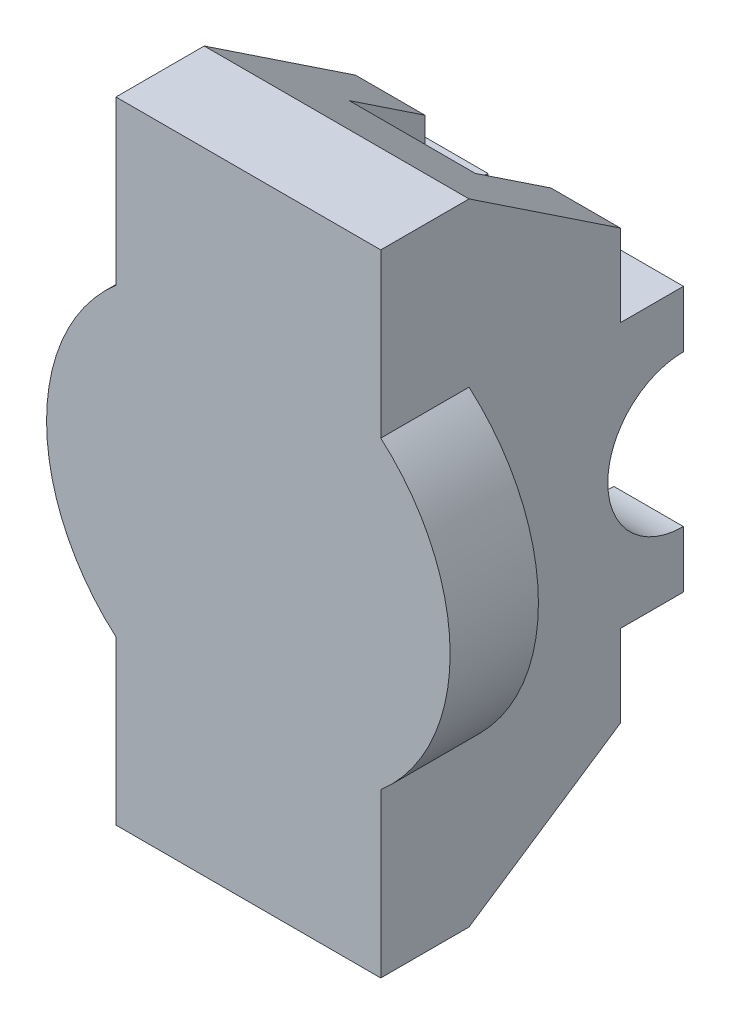
ISO-10303-21;
HEADER;
FILE_DESCRIPTION(('STEP AP214'),'2;1');
FILE_NAME('part.step','',(''),(''),'','','');
FILE_SCHEMA(('AUTOMOTIVE_DESIGN { 1 0 10303 214 1 1 1 1 }'));
ENDSEC;
DATA;
#1=APPLICATION_CONTEXT('core data for automotive mechanical design processes');
#2=APPLICATION_PROTOCOL_DEFINITION('international standard','automotive_design',2000,#1);
#3=PRODUCT_CONTEXT('',#1,'mechanical');
#4=PRODUCT('Part','Part','',(#3));
#5=PRODUCT_RELATED_PRODUCT_CATEGORY('part','',(#4));
#6=PRODUCT_DEFINITION_FORMATION('','',#4);
#7=PRODUCT_DEFINITION_CONTEXT('part definition',#1,'design');
#8=PRODUCT_DEFINITION('design','',#6,#7);
#9=PRODUCT_DEFINITION_SHAPE('','',#8);
#10=(LENGTH_UNIT() NAMED_UNIT(*) SI_UNIT(.MILLI.,.METRE.));
#11=(NAMED_UNIT(*) PLANE_ANGLE_UNIT() SI_UNIT($,.RADIAN.));
#12=(NAMED_UNIT(*) SI_UNIT($,.STERADIAN.) SOLID_ANGLE_UNIT());
#13=UNCERTAINTY_MEASURE_WITH_UNIT(LENGTH_MEASURE(1.E-05),#10,'distance_accuracy_value','');
#14=(GEOMETRIC_REPRESENTATION_CONTEXT(3) GLOBAL_UNCERTAINTY_ASSIGNED_CONTEXT((#13)) GLOBAL_UNIT_ASSIGNED_CONTEXT((#10,
#11,#12)) REPRESENTATION_CONTEXT('',''));
#15=CARTESIAN_POINT('',(0.,0.,0.));
#16=DIRECTION('',(0.,0.,1.));
#17=DIRECTION('',(1.,0.,0.));
#18=AXIS2_PLACEMENT_3D('',#15,#16,#17);
#19=CARTESIAN_POINT('',(-21.,-50.,14.));
#20=DIRECTION('',(0.,1.,0.));
#21=DIRECTION('',(0.,0.,1.));
#22=AXIS2_PLACEMENT_3D('',#19,#20,#21);
#23=PLANE('',#22);
#24=DIRECTION('',(1.,0.,0.));
#25=VECTOR('',#24,1.);
#26=CARTESIAN_POINT('',(-21.,-50.,0.));
#27=LINE('',#26,#25);
#28=CARTESIAN_POINT('',(-21.,-50.,0.));
#29=VERTEX_POINT('',#28);
#30=CARTESIAN_POINT('',(21.,-50.,0.));
#31=VERTEX_POINT('',#30);
#32=EDGE_CURVE('E335',#29,#31,#27,.T.);
#33=ORIENTED_EDGE('',*,*,#32,.T.);
#34=DIRECTION('',(0.,0.,-1.));
#35=VECTOR('',#34,1.);
#36=CARTESIAN_POINT('',(21.,-50.,14.));
#37=LINE('',#36,#35);
#38=CARTESIAN_POINT('',(21.,-50.,14.));
#39=VERTEX_POINT('',#38);
#40=EDGE_CURVE('E332',#39,#31,#37,.T.);
#41=ORIENTED_EDGE('',*,*,#40,.F.);
#42=DIRECTION('',(1.,0.,0.));
#43=VECTOR('',#42,1.);
#44=CARTESIAN_POINT('',(-21.,-50.,14.));
#45=LINE('',#44,#43);
#46=CARTESIAN_POINT('',(-21.,-50.,14.));
#47=VERTEX_POINT('',#46);
#48=EDGE_CURVE('E330',#47,#39,#45,.T.);
#49=ORIENTED_EDGE('',*,*,#48,.F.);
#50=DIRECTION('',(0.,0.,-1.));
#51=VECTOR('',#50,1.);
#52=CARTESIAN_POINT('',(-21.,-50.,14.));
#53=LINE('',#52,#51);
#54=EDGE_CURVE('E339',#47,#29,#53,.T.);
#55=ORIENTED_EDGE('',*,*,#54,.T.);
#56=EDGE_LOOP('',(#33,#41,#49,#55));
#57=FACE_BOUND('',#56,.T.);
#58=ADVANCED_FACE('F39',(#57),#23,.F.);
#59=CARTESIAN_POINT('',(-9.99999999999999,-50.,-12.));
#60=DIRECTION('',(0.,0.,-1.));
#61=DIRECTION('',(-1.,0.,0.));
#62=AXIS2_PLACEMENT_3D('',#59,#60,#61);
#63=PLANE('',#62);
#64=DIRECTION('',(0.,1.,0.));
#65=VECTOR('',#64,1.);
#66=CARTESIAN_POINT('',(9.99999999999999,-50.,-12.));
#67=LINE('',#66,#65);
#68=CARTESIAN_POINT('',(9.99999999999999,-42.,-12.));
#69=VERTEX_POINT('',#68);
#70=CARTESIAN_POINT('',(9.99999999999999,42.,-12.));
#71=VERTEX_POINT('',#70);
#72=EDGE_CURVE('E219',#69,#71,#67,.T.);
#73=ORIENTED_EDGE('',*,*,#72,.F.);
#74=DIRECTION('',(-1.,0.,0.));
#75=VECTOR('',#74,1.);
#76=CARTESIAN_POINT('',(-9.99999999999999,-42.,-12.));
#77=LINE('',#76,#75);
#78=CARTESIAN_POINT('',(-9.99999999999999,-42.,-12.));
#79=VERTEX_POINT('',#78);
#80=EDGE_CURVE('E11',#69,#79,#77,.T.);
#81=ORIENTED_EDGE('',*,*,#80,.T.);
#82=DIRECTION('',(0.,-1.,0.));
#83=VECTOR('',#82,1.);
#84=CARTESIAN_POINT('',(-9.99999999999999,0.,-12.));
#85=LINE('',#84,#83);
#86=CARTESIAN_POINT('',(-9.99999999999999,42.,-12.));
#87=VERTEX_POINT('',#86);
#88=EDGE_CURVE('E47',#87,#79,#85,.T.);
#89=ORIENTED_EDGE('',*,*,#88,.F.);
#90=DIRECTION('',(1.,0.,0.));
#91=VECTOR('',#90,1.);
#92=CARTESIAN_POINT('',(-32.,42.,-12.));
#93=LINE('',#92,#91);
#94=EDGE_CURVE('E221',#87,#71,#93,.T.);
#95=ORIENTED_EDGE('',*,*,#94,.T.);
#96=EDGE_LOOP('',(#73,#81,#89,#95));
#97=FACE_BOUND('',#96,.T.);
#98=ADVANCED_FACE('F220',(#97),#63,.T.);
#99=CARTESIAN_POINT('',(0.,0.,0.));
#100=DIRECTION('',(0.,0.,-1.));
#101=DIRECTION('',(-1.,0.,0.));
#102=AXIS2_PLACEMENT_3D('',#99,#100,#101);
#103=PLANE('',#102);
#104=DIRECTION('',(0.,-1.,0.));
#105=VECTOR('',#104,1.);
#106=CARTESIAN_POINT('',(-21.,50.,0.));
#107=LINE('',#106,#105);
#108=CARTESIAN_POINT('',(-21.,24.1453929352993,0.));
#109=VERTEX_POINT('',#108);
#110=CARTESIAN_POINT('',(-21.,-24.1453929352993,0.));
#111=VERTEX_POINT('',#110);
#112=EDGE_CURVE('E377',#109,#111,#107,.T.);
#113=ORIENTED_EDGE('',*,*,#112,.T.);
#114=CARTESIAN_POINT('',(0.,0.,0.));
#115=DIRECTION('',(0.,0.,1.));
#116=DIRECTION('',(1.,0.,0.));
#117=AXIS2_PLACEMENT_3D('',#114,#115,#116);
#118=CIRCLE('',#117,32.);
#119=EDGE_CURVE('E300',#109,#111,#118,.T.);
#120=ORIENTED_EDGE('',*,*,#119,.F.);
#121=EDGE_LOOP('',(#113,#120));
#122=FACE_BOUND('',#121,.T.);
#123=ADVANCED_FACE('F489',(#122),#103,.T.);
#124=CARTESIAN_POINT('',(21.,-50.,14.));
#125=DIRECTION('',(-1.,0.,0.));
#126=DIRECTION('',(0.,0.,1.));
#127=AXIS2_PLACEMENT_3D('',#124,#125,#126);
#128=PLANE('',#127);
#129=DIRECTION('',(0.,1.,0.));
#130=VECTOR('',#129,1.);
#131=CARTESIAN_POINT('',(21.,-50.,14.));
#132=LINE('',#131,#130);
#133=CARTESIAN_POINT('',(21.,24.1453929352993,14.));
#134=VERTEX_POINT('',#133);
#135=CARTESIAN_POINT('',(21.,50.,14.));
#136=VERTEX_POINT('',#135);
#137=EDGE_CURVE('E325',#134,#136,#132,.T.);
#138=ORIENTED_EDGE('',*,*,#137,.F.);
#139=DIRECTION('',(0.,0.,1.));
#140=VECTOR('',#139,1.);
#141=CARTESIAN_POINT('',(21.,24.1453929352993,0.));
#142=LINE('',#141,#140);
#143=CARTESIAN_POINT('',(21.,24.1453929352993,0.));
#144=VERTEX_POINT('',#143);
#145=EDGE_CURVE('E312',#144,#134,#142,.T.);
#146=ORIENTED_EDGE('',*,*,#145,.F.);
#147=DIRECTION('',(0.,-1.,0.));
#148=VECTOR('',#147,1.);
#149=CARTESIAN_POINT('',(21.,50.,0.));
#150=LINE('',#149,#148);
#151=CARTESIAN_POINT('',(21.,-24.1453929352993,0.));
#152=VERTEX_POINT('',#151);
#153=EDGE_CURVE('E263',#144,#152,#150,.T.);
#154=ORIENTED_EDGE('',*,*,#153,.T.);
#155=DIRECTION('',(0.,0.,1.));
#156=VECTOR('',#155,1.);
#157=CARTESIAN_POINT('',(21.,-24.1453929352993,0.));
#158=LINE('',#157,#156);
#159=CARTESIAN_POINT('',(21.,-24.1453929352993,14.));
#160=VERTEX_POINT('',#159);
#161=EDGE_CURVE('E286',#152,#160,#158,.T.);
#162=ORIENTED_EDGE('',*,*,#161,.T.);
#163=EDGE_CURVE('E321',#39,#160,#132,.T.);
#164=ORIENTED_EDGE('',*,*,#163,.F.);
#165=ORIENTED_EDGE('',*,*,#40,.T.);
#166=DIRECTION('',(0.,0.55470019622523,-0.832050294337843));
#167=VECTOR('',#166,1.);
#168=CARTESIAN_POINT('',(21.,-50.,0.));
#169=LINE('',#168,#167);
#170=CARTESIAN_POINT('',(21.,-34.,-24.));
#171=VERTEX_POINT('',#170);
#172=EDGE_CURVE('E262',#31,#171,#169,.T.);
#173=ORIENTED_EDGE('',*,*,#172,.T.);
#174=DIRECTION('',(0.,1.,0.));
#175=VECTOR('',#174,1.);
#176=CARTESIAN_POINT('',(21.,-21.,-24.));
#177=LINE('',#176,#175);
#178=CARTESIAN_POINT('',(21.,-21.,-24.));
#179=VERTEX_POINT('',#178);
#180=EDGE_CURVE('E268',#171,#179,#177,.T.);
#181=ORIENTED_EDGE('',*,*,#180,.T.);
#182=DIRECTION('',(0.,0.,-1.));
#183=VECTOR('',#182,1.);
#184=CARTESIAN_POINT('',(21.,-21.,-34.));
#185=LINE('',#184,#183);
#186=CARTESIAN_POINT('',(21.,-21.,-34.));
#187=VERTEX_POINT('',#186);
#188=EDGE_CURVE('E271',#179,#187,#185,.T.);
#189=ORIENTED_EDGE('',*,*,#188,.T.);
#190=DIRECTION('',(0.,1.,0.));
#191=VECTOR('',#190,1.);
#192=CARTESIAN_POINT('',(21.,-12.,-34.));
#193=LINE('',#192,#191);
#194=CARTESIAN_POINT('',(21.,-12.,-34.));
#195=VERTEX_POINT('',#194);
#196=EDGE_CURVE('E274',#187,#195,#193,.T.);
#197=ORIENTED_EDGE('',*,*,#196,.T.);
#198=CARTESIAN_POINT('',(21.,0.,-34.));
#199=DIRECTION('',(-1.,0.,0.));
#200=DIRECTION('',(0.,0.,-1.));
#201=AXIS2_PLACEMENT_3D('',#198,#199,#200);
#202=CIRCLE('',#201,12.);
#203=CARTESIAN_POINT('',(21.,12.,-34.));
#204=VERTEX_POINT('',#203);
#205=EDGE_CURVE('E277',#195,#204,#202,.T.);
#206=ORIENTED_EDGE('',*,*,#205,.T.);
#207=DIRECTION('',(0.,1.,0.));
#208=VECTOR('',#207,1.);
#209=CARTESIAN_POINT('',(21.,12.,-34.));
#210=LINE('',#209,#208);
#211=CARTESIAN_POINT('',(21.,21.,-34.));
#212=VERTEX_POINT('',#211);
#213=EDGE_CURVE('E280',#204,#212,#210,.T.);
#214=ORIENTED_EDGE('',*,*,#213,.T.);
#215=DIRECTION('',(0.,0.,1.));
#216=VECTOR('',#215,1.);
#217=CARTESIAN_POINT('',(21.,21.,-34.));
#218=LINE('',#217,#216);
#219=CARTESIAN_POINT('',(21.,21.,-24.));
#220=VERTEX_POINT('',#219);
#221=EDGE_CURVE('E252',#212,#220,#218,.T.);
#222=ORIENTED_EDGE('',*,*,#221,.T.);
#223=DIRECTION('',(0.,1.,0.));
#224=VECTOR('',#223,1.);
#225=CARTESIAN_POINT('',(21.,21.,-24.));
#226=LINE('',#225,#224);
#227=CARTESIAN_POINT('',(21.,34.,-24.));
#228=VERTEX_POINT('',#227);
#229=EDGE_CURVE('E255',#220,#228,#226,.T.);
#230=ORIENTED_EDGE('',*,*,#229,.T.);
#231=DIRECTION('',(0.,0.554700196225229,0.832050294337844));
#232=VECTOR('',#231,1.);
#233=CARTESIAN_POINT('',(21.,34.,-24.));
#234=LINE('',#233,#232);
#235=CARTESIAN_POINT('',(21.,50.,0.));
#236=VERTEX_POINT('',#235);
#237=EDGE_CURVE('E259',#228,#236,#234,.T.);
#238=ORIENTED_EDGE('',*,*,#237,.T.);
#239=DIRECTION('',(0.,0.,-1.));
#240=VECTOR('',#239,1.);
#241=CARTESIAN_POINT('',(21.,50.,14.));
#242=LINE('',#241,#240);
#243=EDGE_CURVE('E265',#136,#236,#242,.T.);
#244=ORIENTED_EDGE('',*,*,#243,.F.);
#245=EDGE_LOOP('',(#138,#146,#154,#162,#164,#165,#173,#181,#189,#197,#206,#214,#222,#230,#238,#244));
#246=FACE_BOUND('',#245,.T.);
#247=ADVANCED_FACE('F41',(#246),#128,.F.);
#248=CARTESIAN_POINT('',(-21.,50.,14.));
#249=DIRECTION('',(0.,-1.,0.));
#250=DIRECTION('',(0.,0.,-1.));
#251=AXIS2_PLACEMENT_3D('',#248,#249,#250);
#252=PLANE('',#251);
#253=DIRECTION('',(-1.,0.,0.));
#254=VECTOR('',#253,1.);
#255=CARTESIAN_POINT('',(-21.,50.,0.));
#256=LINE('',#255,#254);
#257=CARTESIAN_POINT('',(-21.,50.,0.));
#258=VERTEX_POINT('',#257);
#259=EDGE_CURVE('E310',#236,#258,#256,.T.);
#260=ORIENTED_EDGE('',*,*,#259,.T.);
#261=DIRECTION('',(0.,0.,-1.));
#262=VECTOR('',#261,1.);
#263=CARTESIAN_POINT('',(-21.,50.,14.));
#264=LINE('',#263,#262);
#265=CARTESIAN_POINT('',(-21.,50.,14.));
#266=VERTEX_POINT('',#265);
#267=EDGE_CURVE('E342',#266,#258,#264,.T.);
#268=ORIENTED_EDGE('',*,*,#267,.F.);
#269=DIRECTION('',(-1.,0.,0.));
#270=VECTOR('',#269,1.);
#271=CARTESIAN_POINT('',(-21.,50.,14.));
#272=LINE('',#271,#270);
#273=EDGE_CURVE('E324',#136,#266,#272,.T.);
#274=ORIENTED_EDGE('',*,*,#273,.F.);
#275=ORIENTED_EDGE('',*,*,#243,.T.);
#276=EDGE_LOOP('',(#260,#268,#274,#275));
#277=FACE_BOUND('',#276,.T.);
#278=ADVANCED_FACE('F472',(#277),#252,.F.);
#279=CARTESIAN_POINT('',(-21.,-50.,14.));
#280=DIRECTION('',(1.,0.,0.));
#281=DIRECTION('',(0.,0.,-1.));
#282=AXIS2_PLACEMENT_3D('',#279,#280,#281);
#283=PLANE('',#282);
#284=DIRECTION('',(0.,-1.,0.));
#285=VECTOR('',#284,1.);
#286=CARTESIAN_POINT('',(-21.,-50.,14.));
#287=LINE('',#286,#285);
#288=CARTESIAN_POINT('',(-21.,-24.1453929352993,14.));
#289=VERTEX_POINT('',#288);
#290=EDGE_CURVE('E60',#289,#47,#287,.T.);
#291=ORIENTED_EDGE('',*,*,#290,.F.);
#292=DIRECTION('',(0.,0.,1.));
#293=VECTOR('',#292,1.);
#294=CARTESIAN_POINT('',(-21.,-24.1453929352993,0.));
#295=LINE('',#294,#293);
#296=EDGE_CURVE('E303',#111,#289,#295,.T.);
#297=ORIENTED_EDGE('',*,*,#296,.F.);
#298=ORIENTED_EDGE('',*,*,#112,.F.);
#299=DIRECTION('',(0.,0.,1.));
#300=VECTOR('',#299,1.);
#301=CARTESIAN_POINT('',(-21.,24.1453929352993,0.));
#302=LINE('',#301,#300);
#303=CARTESIAN_POINT('',(-21.,24.1453929352993,14.));
#304=VERTEX_POINT('',#303);
#305=EDGE_CURVE('E308',#109,#304,#302,.T.);
#306=ORIENTED_EDGE('',*,*,#305,.T.);
#307=EDGE_CURVE('E327',#266,#304,#287,.T.);
#308=ORIENTED_EDGE('',*,*,#307,.F.);
#309=ORIENTED_EDGE('',*,*,#267,.T.);
#310=DIRECTION('',(0.,0.554700196225229,0.832050294337844));
#311=VECTOR('',#310,1.);
#312=CARTESIAN_POINT('',(-21.,34.,-24.));
#313=LINE('',#312,#311);
#314=CARTESIAN_POINT('',(-21.,34.,-24.));
#315=VERTEX_POINT('',#314);
#316=EDGE_CURVE('E379',#315,#258,#313,.T.);
#317=ORIENTED_EDGE('',*,*,#316,.F.);
#318=DIRECTION('',(0.,1.,0.));
#319=VECTOR('',#318,1.);
#320=CARTESIAN_POINT('',(-21.,21.,-24.));
#321=LINE('',#320,#319);
#322=CARTESIAN_POINT('',(-21.,21.,-24.));
#323=VERTEX_POINT('',#322);
#324=EDGE_CURVE('E381',#323,#315,#321,.T.);
#325=ORIENTED_EDGE('',*,*,#324,.F.);
#326=DIRECTION('',(0.,0.,1.));
#327=VECTOR('',#326,1.);
#328=CARTESIAN_POINT('',(-21.,21.,-34.));
#329=LINE('',#328,#327);
#330=CARTESIAN_POINT('',(-21.,21.,-34.));
#331=VERTEX_POINT('',#330);
#332=EDGE_CURVE('E225',#331,#323,#329,.T.);
#333=ORIENTED_EDGE('',*,*,#332,.F.);
#334=DIRECTION('',(0.,1.,0.));
#335=VECTOR('',#334,1.);
#336=CARTESIAN_POINT('',(-21.,12.,-34.));
#337=LINE('',#336,#335);
#338=CARTESIAN_POINT('',(-21.,12.,-34.));
#339=VERTEX_POINT('',#338);
#340=EDGE_CURVE('E365',#339,#331,#337,.T.);
#341=ORIENTED_EDGE('',*,*,#340,.F.);
#342=CARTESIAN_POINT('',(-21.,0.,-34.));
#343=DIRECTION('',(-1.,0.,0.));
#344=DIRECTION('',(0.,0.,-1.));
#345=AXIS2_PLACEMENT_3D('',#342,#343,#344);
#346=CIRCLE('',#345,12.);
#347=CARTESIAN_POINT('',(-21.,-12.,-34.));
#348=VERTEX_POINT('',#347);
#349=EDGE_CURVE('E367',#348,#339,#346,.T.);
#350=ORIENTED_EDGE('',*,*,#349,.F.);
#351=DIRECTION('',(0.,1.,0.));
#352=VECTOR('',#351,1.);
#353=CARTESIAN_POINT('',(-21.,-12.,-34.));
#354=LINE('',#353,#352);
#355=CARTESIAN_POINT('',(-21.,-21.,-34.));
#356=VERTEX_POINT('',#355);
#357=EDGE_CURVE('E369',#356,#348,#354,.T.);
#358=ORIENTED_EDGE('',*,*,#357,.F.);
#359=DIRECTION('',(0.,0.,-1.));
#360=VECTOR('',#359,1.);
#361=CARTESIAN_POINT('',(-21.,-21.,-34.));
#362=LINE('',#361,#360);
#363=CARTESIAN_POINT('',(-21.,-21.,-24.));
#364=VERTEX_POINT('',#363);
#365=EDGE_CURVE('E371',#364,#356,#362,.T.);
#366=ORIENTED_EDGE('',*,*,#365,.F.);
#367=DIRECTION('',(0.,1.,0.));
#368=VECTOR('',#367,1.);
#369=CARTESIAN_POINT('',(-21.,-21.,-24.));
#370=LINE('',#369,#368);
#371=CARTESIAN_POINT('',(-21.,-34.,-24.));
#372=VERTEX_POINT('',#371);
#373=EDGE_CURVE('E373',#372,#364,#370,.T.);
#374=ORIENTED_EDGE('',*,*,#373,.F.);
#375=DIRECTION('',(0.,0.55470019622523,-0.832050294337843));
#376=VECTOR('',#375,1.);
#377=CARTESIAN_POINT('',(-21.,-50.,0.));
#378=LINE('',#377,#376);
#379=EDGE_CURVE('E375',#29,#372,#378,.T.);
#380=ORIENTED_EDGE('',*,*,#379,.F.);
#381=ORIENTED_EDGE('',*,*,#54,.F.);
#382=EDGE_LOOP('',(#291,#297,#298,#306,#308,#309,#317,#325,#333,#341,#350,#358,#366,#374,#380,#381));
#383=FACE_BOUND('',#382,.T.);
#384=ADVANCED_FACE('F439',(#383),#283,.F.);
#385=CARTESIAN_POINT('',(0.,0.,14.));
#386=DIRECTION('',(0.,0.,-1.));
#387=DIRECTION('',(-1.,0.,0.));
#388=AXIS2_PLACEMENT_3D('',#385,#386,#387);
#389=PLANE('',#388);
#390=ORIENTED_EDGE('',*,*,#163,.T.);
#391=CARTESIAN_POINT('',(0.,0.,14.));
#392=DIRECTION('',(0.,0.,1.));
#393=DIRECTION('',(1.,0.,0.));
#394=AXIS2_PLACEMENT_3D('',#391,#392,#393);
#395=CIRCLE('',#394,32.);
#396=EDGE_CURVE('E307',#160,#134,#395,.T.);
#397=ORIENTED_EDGE('',*,*,#396,.T.);
#398=ORIENTED_EDGE('',*,*,#137,.T.);
#399=ORIENTED_EDGE('',*,*,#273,.T.);
#400=ORIENTED_EDGE('',*,*,#307,.T.);
#401=CARTESIAN_POINT('',(0.,0.,14.));
#402=DIRECTION('',(0.,0.,1.));
#403=DIRECTION('',(1.,0.,0.));
#404=AXIS2_PLACEMENT_3D('',#401,#402,#403);
#405=CIRCLE('',#404,32.);
#406=EDGE_CURVE('E304',#304,#289,#405,.T.);
#407=ORIENTED_EDGE('',*,*,#406,.T.);
#408=ORIENTED_EDGE('',*,*,#290,.T.);
#409=ORIENTED_EDGE('',*,*,#48,.T.);
#410=EDGE_LOOP('',(#390,#397,#398,#399,#400,#407,#408,#409));
#411=FACE_BOUND('',#410,.T.);
#412=ADVANCED_FACE('F496',(#411),#389,.F.);
#413=ORIENTED_EDGE('',*,*,#153,.F.);
#414=CARTESIAN_POINT('',(0.,0.,0.));
#415=DIRECTION('',(0.,0.,1.));
#416=DIRECTION('',(1.,0.,0.));
#417=AXIS2_PLACEMENT_3D('',#414,#415,#416);
#418=CIRCLE('',#417,32.);
#419=EDGE_CURVE('E315',#152,#144,#418,.T.);
#420=ORIENTED_EDGE('',*,*,#419,.F.);
#421=EDGE_LOOP('',(#413,#420));
#422=FACE_BOUND('',#421,.T.);
#423=ADVANCED_FACE('F493',(#422),#103,.T.);
#424=CARTESIAN_POINT('',(0.,0.,0.));
#425=DIRECTION('',(0.,0.,1.));
#426=DIRECTION('',(1.,0.,0.));
#427=AXIS2_PLACEMENT_3D('',#424,#425,#426);
#428=CYLINDRICAL_SURFACE('',#427,32.);
#429=ORIENTED_EDGE('',*,*,#396,.F.);
#430=ORIENTED_EDGE('',*,*,#161,.F.);
#431=ORIENTED_EDGE('',*,*,#419,.T.);
#432=ORIENTED_EDGE('',*,*,#145,.T.);
#433=EDGE_LOOP('',(#429,#430,#431,#432));
#434=FACE_BOUND('',#433,.T.);
#435=ADVANCED_FACE('F512',(#434),#428,.T.);
#436=CARTESIAN_POINT('',(0.,0.,0.));
#437=DIRECTION('',(0.,0.,1.));
#438=DIRECTION('',(1.,0.,0.));
#439=AXIS2_PLACEMENT_3D('',#436,#437,#438);
#440=CYLINDRICAL_SURFACE('',#439,32.);
#441=ORIENTED_EDGE('',*,*,#406,.F.);
#442=ORIENTED_EDGE('',*,*,#305,.F.);
#443=ORIENTED_EDGE('',*,*,#119,.T.);
#444=ORIENTED_EDGE('',*,*,#296,.T.);
#445=EDGE_LOOP('',(#441,#442,#443,#444));
#446=FACE_BOUND('',#445,.T.);
#447=ADVANCED_FACE('F517',(#446),#440,.T.);
#448=CARTESIAN_POINT('',(9.99999999999999,21.,-34.));
#449=DIRECTION('',(0.,1.,0.));
#450=DIRECTION('',(0.,0.,1.));
#451=AXIS2_PLACEMENT_3D('',#448,#449,#450);
#452=PLANE('',#451);
#453=ORIENTED_EDGE('',*,*,#221,.F.);
#454=DIRECTION('',(1.,0.,0.));
#455=VECTOR('',#454,1.);
#456=CARTESIAN_POINT('',(9.99999999999999,21.,-34.));
#457=LINE('',#456,#455);
#458=CARTESIAN_POINT('',(9.99999999999999,21.,-34.));
#459=VERTEX_POINT('',#458);
#460=EDGE_CURVE('E284',#459,#212,#457,.T.);
#461=ORIENTED_EDGE('',*,*,#460,.F.);
#462=DIRECTION('',(0.,0.,1.));
#463=VECTOR('',#462,1.);
#464=CARTESIAN_POINT('',(9.99999999999999,21.,-34.));
#465=LINE('',#464,#463);
#466=CARTESIAN_POINT('',(9.99999999999999,21.,-24.));
#467=VERTEX_POINT('',#466);
#468=EDGE_CURVE('E283',#459,#467,#465,.T.);
#469=ORIENTED_EDGE('',*,*,#468,.T.);
#470=DIRECTION('',(1.,0.,0.));
#471=VECTOR('',#470,1.);
#472=CARTESIAN_POINT('',(9.99999999999999,21.,-24.));
#473=LINE('',#472,#471);
#474=EDGE_CURVE('E251',#467,#220,#473,.T.);
#475=ORIENTED_EDGE('',*,*,#474,.T.);
#476=EDGE_LOOP('',(#453,#461,#469,#475));
#477=FACE_BOUND('',#476,.T.);
#478=ADVANCED_FACE('F416',(#477),#452,.T.);
#479=CARTESIAN_POINT('',(9.99999999999999,12.,-34.));
#480=DIRECTION('',(0.,0.,-1.));
#481=DIRECTION('',(-1.,0.,0.));
#482=AXIS2_PLACEMENT_3D('',#479,#480,#481);
#483=PLANE('',#482);
#484=ORIENTED_EDGE('',*,*,#213,.F.);
#485=DIRECTION('',(1.,0.,0.));
#486=VECTOR('',#485,1.);
#487=CARTESIAN_POINT('',(9.99999999999999,12.,-34.));
#488=LINE('',#487,#486);
#489=CARTESIAN_POINT('',(9.99999999999999,12.,-34.));
#490=VERTEX_POINT('',#489);
#491=EDGE_CURVE('E287',#490,#204,#488,.T.);
#492=ORIENTED_EDGE('',*,*,#491,.F.);
#493=DIRECTION('',(0.,1.,0.));
#494=VECTOR('',#493,1.);
#495=CARTESIAN_POINT('',(9.99999999999999,12.,-34.));
#496=LINE('',#495,#494);
#497=EDGE_CURVE('E248',#490,#459,#496,.T.);
#498=ORIENTED_EDGE('',*,*,#497,.T.);
#499=ORIENTED_EDGE('',*,*,#460,.T.);
#500=EDGE_LOOP('',(#484,#492,#498,#499));
#501=FACE_BOUND('',#500,.T.);
#502=ADVANCED_FACE('F419',(#501),#483,.T.);
#503=CARTESIAN_POINT('',(9.99999999999999,0.,-34.));
#504=DIRECTION('',(1.,0.,0.));
#505=DIRECTION('',(0.,0.,-1.));
#506=AXIS2_PLACEMENT_3D('',#503,#504,#505);
#507=CYLINDRICAL_SURFACE('',#506,12.);
#508=ORIENTED_EDGE('',*,*,#205,.F.);
#509=DIRECTION('',(1.,0.,0.));
#510=VECTOR('',#509,1.);
#511=CARTESIAN_POINT('',(9.99999999999999,-12.,-34.));
#512=LINE('',#511,#510);
#513=CARTESIAN_POINT('',(9.99999999999999,-12.,-34.));
#514=VERTEX_POINT('',#513);
#515=EDGE_CURVE('E289',#514,#195,#512,.T.);
#516=ORIENTED_EDGE('',*,*,#515,.F.);
#517=CARTESIAN_POINT('',(9.99999999999999,0.,-34.));
#518=DIRECTION('',(-1.,0.,0.));
#519=DIRECTION('',(0.,0.,-1.));
#520=AXIS2_PLACEMENT_3D('',#517,#518,#519);
#521=CIRCLE('',#520,12.);
#522=EDGE_CURVE('E245',#514,#490,#521,.T.);
#523=ORIENTED_EDGE('',*,*,#522,.T.);
#524=ORIENTED_EDGE('',*,*,#491,.T.);
#525=EDGE_LOOP('',(#508,#516,#523,#524));
#526=FACE_BOUND('',#525,.T.);
#527=ADVANCED_FACE('F474',(#526),#507,.F.);
#528=CARTESIAN_POINT('',(9.99999999999999,-12.,-34.));
#529=DIRECTION('',(0.,0.,-1.));
#530=DIRECTION('',(-1.,0.,0.));
#531=AXIS2_PLACEMENT_3D('',#528,#529,#530);
#532=PLANE('',#531);
#533=ORIENTED_EDGE('',*,*,#196,.F.);
#534=DIRECTION('',(1.,0.,0.));
#535=VECTOR('',#534,1.);
#536=CARTESIAN_POINT('',(9.99999999999999,-21.,-34.));
#537=LINE('',#536,#535);
#538=CARTESIAN_POINT('',(9.99999999999999,-21.,-34.));
#539=VERTEX_POINT('',#538);
#540=EDGE_CURVE('E291',#539,#187,#537,.T.);
#541=ORIENTED_EDGE('',*,*,#540,.F.);
#542=DIRECTION('',(0.,1.,0.));
#543=VECTOR('',#542,1.);
#544=CARTESIAN_POINT('',(9.99999999999999,-12.,-34.));
#545=LINE('',#544,#543);
#546=EDGE_CURVE('E242',#539,#514,#545,.T.);
#547=ORIENTED_EDGE('',*,*,#546,.T.);
#548=ORIENTED_EDGE('',*,*,#515,.T.);
#549=EDGE_LOOP('',(#533,#541,#547,#548));
#550=FACE_BOUND('',#549,.T.);
#551=ADVANCED_FACE('F425',(#550),#532,.T.);
#552=CARTESIAN_POINT('',(9.99999999999999,-21.,-34.));
#553=DIRECTION('',(0.,-1.,0.));
#554=DIRECTION('',(0.,0.,-1.));
#555=AXIS2_PLACEMENT_3D('',#552,#553,#554);
#556=PLANE('',#555);
#557=ORIENTED_EDGE('',*,*,#188,.F.);
#558=DIRECTION('',(1.,0.,0.));
#559=VECTOR('',#558,1.);
#560=CARTESIAN_POINT('',(9.99999999999999,-21.,-24.));
#561=LINE('',#560,#559);
#562=CARTESIAN_POINT('',(9.99999999999999,-21.,-24.));
#563=VERTEX_POINT('',#562);
#564=EDGE_CURVE('E293',#563,#179,#561,.T.);
#565=ORIENTED_EDGE('',*,*,#564,.F.);
#566=DIRECTION('',(0.,0.,-1.));
#567=VECTOR('',#566,1.);
#568=CARTESIAN_POINT('',(9.99999999999999,-21.,-34.));
#569=LINE('',#568,#567);
#570=EDGE_CURVE('E234',#563,#539,#569,.T.);
#571=ORIENTED_EDGE('',*,*,#570,.T.);
#572=ORIENTED_EDGE('',*,*,#540,.T.);
#573=EDGE_LOOP('',(#557,#565,#571,#572));
#574=FACE_BOUND('',#573,.T.);
#575=ADVANCED_FACE('F429',(#574),#556,.T.);
#576=CARTESIAN_POINT('',(9.99999999999999,-21.,-24.));
#577=DIRECTION('',(0.,0.,-1.));
#578=DIRECTION('',(-1.,0.,0.));
#579=AXIS2_PLACEMENT_3D('',#576,#577,#578);
#580=PLANE('',#579);
#581=ORIENTED_EDGE('',*,*,#180,.F.);
#582=DIRECTION('',(1.,0.,0.));
#583=VECTOR('',#582,1.);
#584=CARTESIAN_POINT('',(9.99999999999999,-34.,-24.));
#585=LINE('',#584,#583);
#586=CARTESIAN_POINT('',(9.99999999999999,-34.,-24.));
#587=VERTEX_POINT('',#586);
#588=EDGE_CURVE('E295',#587,#171,#585,.T.);
#589=ORIENTED_EDGE('',*,*,#588,.F.);
#590=DIRECTION('',(0.,1.,0.));
#591=VECTOR('',#590,1.);
#592=CARTESIAN_POINT('',(9.99999999999999,-21.,-24.));
#593=LINE('',#592,#591);
#594=EDGE_CURVE('E231',#587,#563,#593,.T.);
#595=ORIENTED_EDGE('',*,*,#594,.T.);
#596=ORIENTED_EDGE('',*,*,#564,.T.);
#597=EDGE_LOOP('',(#581,#589,#595,#596));
#598=FACE_BOUND('',#597,.T.);
#599=ADVANCED_FACE('F432',(#598),#580,.T.);
#600=CARTESIAN_POINT('',(9.99999999999999,-50.,0.));
#601=DIRECTION('',(0.,-0.832050294337843,-0.55470019622523));
#602=DIRECTION('',(0.,0.55470019622523,-0.832050294337843));
#603=AXIS2_PLACEMENT_3D('',#600,#601,#602);
#604=PLANE('',#603);
#605=ORIENTED_EDGE('',*,*,#172,.F.);
#606=ORIENTED_EDGE('',*,*,#32,.F.);
#607=ORIENTED_EDGE('',*,*,#379,.T.);
#608=DIRECTION('',(-1.,0.,0.));
#609=VECTOR('',#608,1.);
#610=CARTESIAN_POINT('',(-9.99999999999999,-34.,-24.));
#611=LINE('',#610,#609);
#612=CARTESIAN_POINT('',(-9.99999999999999,-34.,-24.));
#613=VERTEX_POINT('',#612);
#614=EDGE_CURVE('E388',#613,#372,#611,.T.);
#615=ORIENTED_EDGE('',*,*,#614,.F.);
#616=DIRECTION('',(0.,0.55470019622523,-0.832050294337843));
#617=VECTOR('',#616,1.);
#618=CARTESIAN_POINT('',(-9.99999999999999,-50.,0.));
#619=LINE('',#618,#617);
#620=EDGE_CURVE('E217',#79,#613,#619,.T.);
#621=ORIENTED_EDGE('',*,*,#620,.F.);
#622=ORIENTED_EDGE('',*,*,#80,.F.);
#623=DIRECTION('',(0.,0.55470019622523,-0.832050294337843));
#624=VECTOR('',#623,1.);
#625=CARTESIAN_POINT('',(9.99999999999999,-50.,0.));
#626=LINE('',#625,#624);
#627=EDGE_CURVE('E214',#69,#587,#626,.T.);
#628=ORIENTED_EDGE('',*,*,#627,.T.);
#629=ORIENTED_EDGE('',*,*,#588,.T.);
#630=EDGE_LOOP('',(#605,#606,#607,#615,#621,#622,#628,#629));
#631=FACE_BOUND('',#630,.T.);
#632=ADVANCED_FACE('F212',(#631),#604,.T.);
#633=CARTESIAN_POINT('',(9.99999999999999,34.,-24.));
#634=DIRECTION('',(0.,0.832050294337844,-0.554700196225229));
#635=DIRECTION('',(0.,0.554700196225229,0.832050294337844));
#636=AXIS2_PLACEMENT_3D('',#633,#634,#635);
#637=PLANE('',#636);
#638=ORIENTED_EDGE('',*,*,#237,.F.);
#639=DIRECTION('',(1.,0.,0.));
#640=VECTOR('',#639,1.);
#641=CARTESIAN_POINT('',(9.99999999999999,34.,-24.));
#642=LINE('',#641,#640);
#643=CARTESIAN_POINT('',(9.99999999999999,34.,-24.));
#644=VERTEX_POINT('',#643);
#645=EDGE_CURVE('E297',#644,#228,#642,.T.);
#646=ORIENTED_EDGE('',*,*,#645,.F.);
#647=DIRECTION('',(0.,0.554700196225229,0.832050294337844));
#648=VECTOR('',#647,1.);
#649=CARTESIAN_POINT('',(9.99999999999999,34.,-24.));
#650=LINE('',#649,#648);
#651=EDGE_CURVE('E232',#644,#71,#650,.T.);
#652=ORIENTED_EDGE('',*,*,#651,.T.);
#653=ORIENTED_EDGE('',*,*,#94,.F.);
#654=DIRECTION('',(0.,0.554700196225229,0.832050294337844));
#655=VECTOR('',#654,1.);
#656=CARTESIAN_POINT('',(-9.99999999999999,34.,-24.));
#657=LINE('',#656,#655);
#658=CARTESIAN_POINT('',(-9.99999999999999,34.,-24.));
#659=VERTEX_POINT('',#658);
#660=EDGE_CURVE('E350',#659,#87,#657,.T.);
#661=ORIENTED_EDGE('',*,*,#660,.F.);
#662=DIRECTION('',(-1.,0.,0.));
#663=VECTOR('',#662,1.);
#664=CARTESIAN_POINT('',(-9.99999999999999,34.,-24.));
#665=LINE('',#664,#663);
#666=EDGE_CURVE('E386',#659,#315,#665,.T.);
#667=ORIENTED_EDGE('',*,*,#666,.T.);
#668=ORIENTED_EDGE('',*,*,#316,.T.);
#669=ORIENTED_EDGE('',*,*,#259,.F.);
#670=EDGE_LOOP('',(#638,#646,#652,#653,#661,#667,#668,#669));
#671=FACE_BOUND('',#670,.T.);
#672=ADVANCED_FACE('F467',(#671),#637,.T.);
#673=CARTESIAN_POINT('',(9.99999999999999,21.,-24.));
#674=DIRECTION('',(0.,0.,-1.));
#675=DIRECTION('',(-1.,0.,0.));
#676=AXIS2_PLACEMENT_3D('',#673,#674,#675);
#677=PLANE('',#676);
#678=ORIENTED_EDGE('',*,*,#229,.F.);
#679=ORIENTED_EDGE('',*,*,#474,.F.);
#680=DIRECTION('',(0.,1.,0.));
#681=VECTOR('',#680,1.);
#682=CARTESIAN_POINT('',(9.99999999999999,21.,-24.));
#683=LINE('',#682,#681);
#684=EDGE_CURVE('E236',#467,#644,#683,.T.);
#685=ORIENTED_EDGE('',*,*,#684,.T.);
#686=ORIENTED_EDGE('',*,*,#645,.T.);
#687=EDGE_LOOP('',(#678,#679,#685,#686));
#688=FACE_BOUND('',#687,.T.);
#689=ADVANCED_FACE('F410',(#688),#677,.T.);
#690=CARTESIAN_POINT('',(9.99999999999999,0.,-34.));
#691=DIRECTION('',(1.,0.,0.));
#692=DIRECTION('',(0.,0.,-1.));
#693=AXIS2_PLACEMENT_3D('',#690,#691,#692);
#694=PLANE('',#693);
#695=ORIENTED_EDGE('',*,*,#627,.F.);
#696=ORIENTED_EDGE('',*,*,#72,.T.);
#697=ORIENTED_EDGE('',*,*,#651,.F.);
#698=ORIENTED_EDGE('',*,*,#684,.F.);
#699=ORIENTED_EDGE('',*,*,#468,.F.);
#700=ORIENTED_EDGE('',*,*,#497,.F.);
#701=ORIENTED_EDGE('',*,*,#522,.F.);
#702=ORIENTED_EDGE('',*,*,#546,.F.);
#703=ORIENTED_EDGE('',*,*,#570,.F.);
#704=ORIENTED_EDGE('',*,*,#594,.F.);
#705=EDGE_LOOP('',(#695,#696,#697,#698,#699,#700,#701,#702,#703,#704));
#706=FACE_BOUND('',#705,.T.);
#707=ADVANCED_FACE('F228',(#706),#694,.F.);
#708=CARTESIAN_POINT('',(-9.99999999999999,21.,-34.));
#709=DIRECTION('',(0.,-1.,0.));
#710=DIRECTION('',(0.,0.,-1.));
#711=AXIS2_PLACEMENT_3D('',#708,#709,#710);
#712=PLANE('',#711);
#713=ORIENTED_EDGE('',*,*,#332,.T.);
#714=DIRECTION('',(-1.,0.,0.));
#715=VECTOR('',#714,1.);
#716=CARTESIAN_POINT('',(-9.99999999999999,21.,-24.));
#717=LINE('',#716,#715);
#718=CARTESIAN_POINT('',(-9.99999999999999,21.,-24.));
#719=VERTEX_POINT('',#718);
#720=EDGE_CURVE('E256',#719,#323,#717,.T.);
#721=ORIENTED_EDGE('',*,*,#720,.F.);
#722=DIRECTION('',(0.,0.,1.));
#723=VECTOR('',#722,1.);
#724=CARTESIAN_POINT('',(-9.99999999999999,21.,-34.));
#725=LINE('',#724,#723);
#726=CARTESIAN_POINT('',(-9.99999999999999,21.,-34.));
#727=VERTEX_POINT('',#726);
#728=EDGE_CURVE('E383',#727,#719,#725,.T.);
#729=ORIENTED_EDGE('',*,*,#728,.F.);
#730=DIRECTION('',(-1.,0.,0.));
#731=VECTOR('',#730,1.);
#732=CARTESIAN_POINT('',(-9.99999999999999,21.,-34.));
#733=LINE('',#732,#731);
#734=EDGE_CURVE('E357',#727,#331,#733,.T.);
#735=ORIENTED_EDGE('',*,*,#734,.T.);
#736=EDGE_LOOP('',(#713,#721,#729,#735));
#737=FACE_BOUND('',#736,.T.);
#738=ADVANCED_FACE('F462',(#737),#712,.F.);
#739=CARTESIAN_POINT('',(-9.99999999999999,21.,-24.));
#740=DIRECTION('',(0.,0.,1.));
#741=DIRECTION('',(1.,0.,0.));
#742=AXIS2_PLACEMENT_3D('',#739,#740,#741);
#743=PLANE('',#742);
#744=ORIENTED_EDGE('',*,*,#324,.T.);
#745=ORIENTED_EDGE('',*,*,#666,.F.);
#746=DIRECTION('',(0.,1.,0.));
#747=VECTOR('',#746,1.);
#748=CARTESIAN_POINT('',(-9.99999999999999,21.,-24.));
#749=LINE('',#748,#747);
#750=EDGE_CURVE('E352',#719,#659,#749,.T.);
#751=ORIENTED_EDGE('',*,*,#750,.F.);
#752=ORIENTED_EDGE('',*,*,#720,.T.);
#753=EDGE_LOOP('',(#744,#745,#751,#752));
#754=FACE_BOUND('',#753,.T.);
#755=ADVANCED_FACE('F465',(#754),#743,.F.);
#756=CARTESIAN_POINT('',(-9.99999999999999,-21.,-24.));
#757=DIRECTION('',(0.,0.,1.));
#758=DIRECTION('',(1.,0.,0.));
#759=AXIS2_PLACEMENT_3D('',#756,#757,#758);
#760=PLANE('',#759);
#761=ORIENTED_EDGE('',*,*,#373,.T.);
#762=DIRECTION('',(-1.,0.,0.));
#763=VECTOR('',#762,1.);
#764=CARTESIAN_POINT('',(-9.99999999999999,-21.,-24.));
#765=LINE('',#764,#763);
#766=CARTESIAN_POINT('',(-9.99999999999999,-21.,-24.));
#767=VERTEX_POINT('',#766);
#768=EDGE_CURVE('E391',#767,#364,#765,.T.);
#769=ORIENTED_EDGE('',*,*,#768,.F.);
#770=DIRECTION('',(0.,1.,0.));
#771=VECTOR('',#770,1.);
#772=CARTESIAN_POINT('',(-9.99999999999999,-21.,-24.));
#773=LINE('',#772,#771);
#774=EDGE_CURVE('E359',#613,#767,#773,.T.);
#775=ORIENTED_EDGE('',*,*,#774,.F.);
#776=ORIENTED_EDGE('',*,*,#614,.T.);
#777=EDGE_LOOP('',(#761,#769,#775,#776));
#778=FACE_BOUND('',#777,.T.);
#779=ADVANCED_FACE('F444',(#778),#760,.F.);
#780=CARTESIAN_POINT('',(-9.99999999999999,-21.,-34.));
#781=DIRECTION('',(0.,1.,0.));
#782=DIRECTION('',(0.,0.,1.));
#783=AXIS2_PLACEMENT_3D('',#780,#781,#782);
#784=PLANE('',#783);
#785=ORIENTED_EDGE('',*,*,#365,.T.);
#786=DIRECTION('',(-1.,0.,0.));
#787=VECTOR('',#786,1.);
#788=CARTESIAN_POINT('',(-9.99999999999999,-21.,-34.));
#789=LINE('',#788,#787);
#790=CARTESIAN_POINT('',(-9.99999999999999,-21.,-34.));
#791=VERTEX_POINT('',#790);
#792=EDGE_CURVE('E394',#791,#356,#789,.T.);
#793=ORIENTED_EDGE('',*,*,#792,.F.);
#794=DIRECTION('',(0.,0.,-1.));
#795=VECTOR('',#794,1.);
#796=CARTESIAN_POINT('',(-9.99999999999999,-21.,-34.));
#797=LINE('',#796,#795);
#798=EDGE_CURVE('E447',#767,#791,#797,.T.);
#799=ORIENTED_EDGE('',*,*,#798,.F.);
#800=ORIENTED_EDGE('',*,*,#768,.T.);
#801=EDGE_LOOP('',(#785,#793,#799,#800));
#802=FACE_BOUND('',#801,.T.);
#803=ADVANCED_FACE('F607',(#802),#784,.F.);
#804=CARTESIAN_POINT('',(-9.99999999999999,-12.,-34.));
#805=DIRECTION('',(0.,0.,1.));
#806=DIRECTION('',(1.,0.,0.));
#807=AXIS2_PLACEMENT_3D('',#804,#805,#806);
#808=PLANE('',#807);
#809=ORIENTED_EDGE('',*,*,#357,.T.);
#810=DIRECTION('',(-1.,0.,0.));
#811=VECTOR('',#810,1.);
#812=CARTESIAN_POINT('',(-9.99999999999999,-12.,-34.));
#813=LINE('',#812,#811);
#814=CARTESIAN_POINT('',(-9.99999999999999,-12.,-34.));
#815=VERTEX_POINT('',#814);
#816=EDGE_CURVE('E397',#815,#348,#813,.T.);
#817=ORIENTED_EDGE('',*,*,#816,.F.);
#818=DIRECTION('',(0.,1.,0.));
#819=VECTOR('',#818,1.);
#820=CARTESIAN_POINT('',(-9.99999999999999,-12.,-34.));
#821=LINE('',#820,#819);
#822=EDGE_CURVE('E448',#791,#815,#821,.T.);
#823=ORIENTED_EDGE('',*,*,#822,.F.);
#824=ORIENTED_EDGE('',*,*,#792,.T.);
#825=EDGE_LOOP('',(#809,#817,#823,#824));
#826=FACE_BOUND('',#825,.T.);
#827=ADVANCED_FACE('F616',(#826),#808,.F.);
#828=CARTESIAN_POINT('',(-9.99999999999999,0.,-34.));
#829=DIRECTION('',(-1.,0.,0.));
#830=DIRECTION('',(0.,0.,1.));
#831=AXIS2_PLACEMENT_3D('',#828,#829,#830);
#832=CYLINDRICAL_SURFACE('',#831,12.);
#833=ORIENTED_EDGE('',*,*,#349,.T.);
#834=DIRECTION('',(-1.,0.,0.));
#835=VECTOR('',#834,1.);
#836=CARTESIAN_POINT('',(-9.99999999999999,12.,-34.));
#837=LINE('',#836,#835);
#838=CARTESIAN_POINT('',(-9.99999999999999,12.,-34.));
#839=VERTEX_POINT('',#838);
#840=EDGE_CURVE('E400',#839,#339,#837,.T.);
#841=ORIENTED_EDGE('',*,*,#840,.F.);
#842=CARTESIAN_POINT('',(-9.99999999999999,0.,-34.));
#843=DIRECTION('',(-1.,0.,0.));
#844=DIRECTION('',(0.,0.,-1.));
#845=AXIS2_PLACEMENT_3D('',#842,#843,#844);
#846=CIRCLE('',#845,12.);
#847=EDGE_CURVE('E452',#815,#839,#846,.T.);
#848=ORIENTED_EDGE('',*,*,#847,.F.);
#849=ORIENTED_EDGE('',*,*,#816,.T.);
#850=EDGE_LOOP('',(#833,#841,#848,#849));
#851=FACE_BOUND('',#850,.T.);
#852=ADVANCED_FACE('F626',(#851),#832,.F.);
#853=CARTESIAN_POINT('',(-9.99999999999999,12.,-34.));
#854=DIRECTION('',(0.,0.,1.));
#855=DIRECTION('',(1.,0.,0.));
#856=AXIS2_PLACEMENT_3D('',#853,#854,#855);
#857=PLANE('',#856);
#858=ORIENTED_EDGE('',*,*,#340,.T.);
#859=ORIENTED_EDGE('',*,*,#734,.F.);
#860=DIRECTION('',(0.,1.,0.));
#861=VECTOR('',#860,1.);
#862=CARTESIAN_POINT('',(-9.99999999999999,12.,-34.));
#863=LINE('',#862,#861);
#864=EDGE_CURVE('E454',#839,#727,#863,.T.);
#865=ORIENTED_EDGE('',*,*,#864,.F.);
#866=ORIENTED_EDGE('',*,*,#840,.T.);
#867=EDGE_LOOP('',(#858,#859,#865,#866));
#868=FACE_BOUND('',#867,.T.);
#869=ADVANCED_FACE('F636',(#868),#857,.F.);
#870=CARTESIAN_POINT('',(-9.99999999999999,0.,-34.));
#871=DIRECTION('',(-1.,0.,0.));
#872=DIRECTION('',(0.,0.,-1.));
#873=AXIS2_PLACEMENT_3D('',#870,#871,#872);
#874=PLANE('',#873);
#875=ORIENTED_EDGE('',*,*,#660,.T.);
#876=ORIENTED_EDGE('',*,*,#88,.T.);
#877=ORIENTED_EDGE('',*,*,#620,.T.);
#878=ORIENTED_EDGE('',*,*,#774,.T.);
#879=ORIENTED_EDGE('',*,*,#798,.T.);
#880=ORIENTED_EDGE('',*,*,#822,.T.);
#881=ORIENTED_EDGE('',*,*,#847,.T.);
#882=ORIENTED_EDGE('',*,*,#864,.T.);
#883=ORIENTED_EDGE('',*,*,#728,.T.);
#884=ORIENTED_EDGE('',*,*,#750,.T.);
#885=EDGE_LOOP('',(#875,#876,#877,#878,#879,#880,#881,#882,#883,#884));
#886=FACE_BOUND('',#885,.T.);
#887=ADVANCED_FACE('F348',(#886),#874,.F.);
#888=CLOSED_SHELL('',(#58,#98,#123,#247,#278,#384,#412,#423,#435,#447,#478,#502,#527,#551,#575,
#599,#632,#672,#689,#707,#738,#755,#779,#803,#827,#852,#869,#887));
#889=MANIFOLD_SOLID_BREP('B2',#888);
#890=ADVANCED_BREP_SHAPE_REPRESENTATION('',(#18,#889),#14);
#891=SHAPE_DEFINITION_REPRESENTATION(#9,#890);
ENDSEC;
END-ISO-10303-21;
